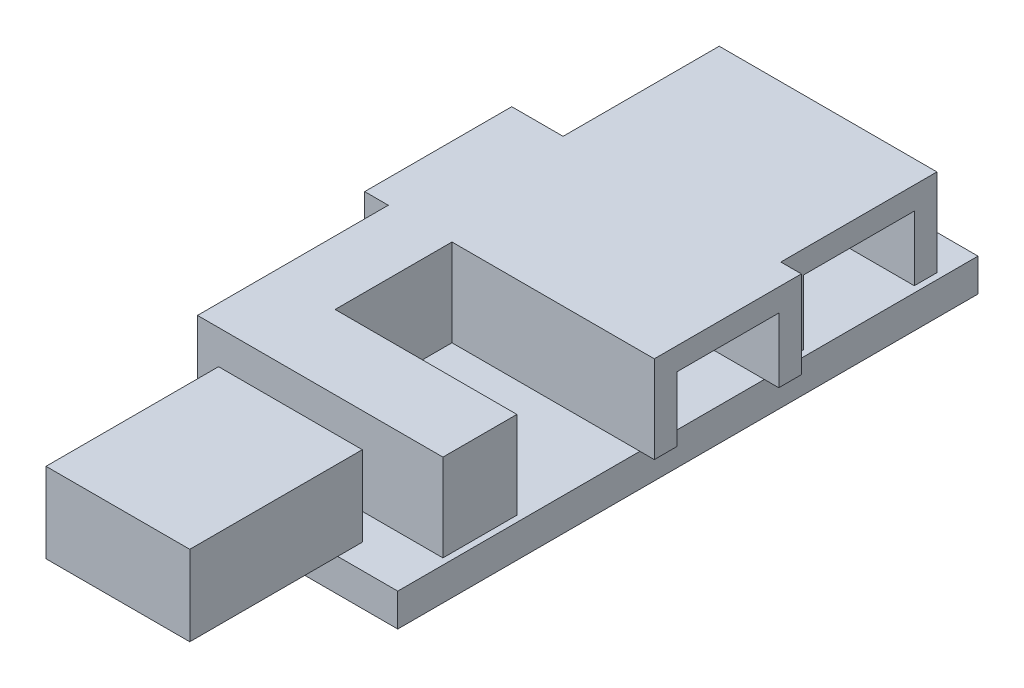
ISO-10303-21;
HEADER;
FILE_DESCRIPTION(('STEP AP214'),'2;1');
FILE_NAME('part.step','',(''),(''),'','','');
FILE_SCHEMA(('AUTOMOTIVE_DESIGN { 1 0 10303 214 1 1 1 1 }'));
ENDSEC;
DATA;
#1=APPLICATION_CONTEXT('core data for automotive mechanical design processes');
#2=APPLICATION_PROTOCOL_DEFINITION('international standard','automotive_design',2000,#1);
#3=PRODUCT_CONTEXT('',#1,'mechanical');
#4=PRODUCT('Part','Part','',(#3));
#5=PRODUCT_RELATED_PRODUCT_CATEGORY('part','',(#4));
#6=PRODUCT_DEFINITION_FORMATION('','',#4);
#7=PRODUCT_DEFINITION_CONTEXT('part definition',#1,'design');
#8=PRODUCT_DEFINITION('design','',#6,#7);
#9=PRODUCT_DEFINITION_SHAPE('','',#8);
#10=(LENGTH_UNIT() NAMED_UNIT(*) SI_UNIT(.MILLI.,.METRE.));
#11=(NAMED_UNIT(*) PLANE_ANGLE_UNIT() SI_UNIT($,.RADIAN.));
#12=(NAMED_UNIT(*) SI_UNIT($,.STERADIAN.) SOLID_ANGLE_UNIT());
#13=UNCERTAINTY_MEASURE_WITH_UNIT(LENGTH_MEASURE(1.E-05),#10,'distance_accuracy_value','');
#14=(GEOMETRIC_REPRESENTATION_CONTEXT(3) GLOBAL_UNCERTAINTY_ASSIGNED_CONTEXT((#13)) GLOBAL_UNIT_ASSIGNED_CONTEXT((#10,
#11,#12)) REPRESENTATION_CONTEXT('',''));
#15=CARTESIAN_POINT('',(0.,0.,0.));
#16=DIRECTION('',(0.,0.,1.));
#17=DIRECTION('',(1.,0.,0.));
#18=AXIS2_PLACEMENT_3D('',#15,#16,#17);
#19=CARTESIAN_POINT('',(-62.6318930317582,4.064,0.824393123125533));
#20=DIRECTION('',(0.,1.,0.));
#21=DIRECTION('',(0.,0.,1.));
#22=AXIS2_PLACEMENT_3D('',#19,#20,#21);
#23=PLANE('',#22);
#24=DIRECTION('',(0.,0.,1.));
#25=VECTOR('',#24,1.);
#26=CARTESIAN_POINT('',(-16.3195,4.064,-35.8775));
#27=LINE('',#26,#25);
#28=CARTESIAN_POINT('',(-16.3195,4.064,-12.2555));
#29=VERTEX_POINT('',#28);
#30=CARTESIAN_POINT('',(-16.3195,4.064,-9.46150000000001));
#31=VERTEX_POINT('',#30);
#32=EDGE_CURVE('E295',#29,#31,#27,.T.);
#33=ORIENTED_EDGE('',*,*,#32,.T.);
#34=DIRECTION('',(1.,0.,0.));
#35=VECTOR('',#34,1.);
#36=CARTESIAN_POINT('',(-17.716525,4.064,-9.46150000000001));
#37=LINE('',#36,#35);
#38=CARTESIAN_POINT('',(-17.7165,4.064,-9.46150000000001));
#39=VERTEX_POINT('',#38);
#40=EDGE_CURVE('E598',#39,#31,#37,.T.);
#41=ORIENTED_EDGE('',*,*,#40,.F.);
#42=DIRECTION('',(0.,0.,1.));
#43=VECTOR('',#42,1.);
#44=CARTESIAN_POINT('',(-17.7165,4.064,-12.2555));
#45=LINE('',#44,#43);
#46=CARTESIAN_POINT('',(-17.7165,4.064,-12.2555));
#47=VERTEX_POINT('',#46);
#48=EDGE_CURVE('E366',#47,#39,#45,.T.);
#49=ORIENTED_EDGE('',*,*,#48,.F.);
#50=DIRECTION('',(-1.,0.,0.));
#51=VECTOR('',#50,1.);
#52=CARTESIAN_POINT('',(18.0975,4.064,-12.2555));
#53=LINE('',#52,#51);
#54=EDGE_CURVE('E464',#29,#47,#53,.T.);
#55=ORIENTED_EDGE('',*,*,#54,.F.);
#56=EDGE_LOOP('',(#33,#41,#49,#55));
#57=FACE_BOUND('',#56,.T.);
#58=ADVANCED_FACE('F39',(#57),#23,.F.);
#59=DIRECTION('',(0.,0.,1.));
#60=VECTOR('',#59,1.);
#61=CARTESIAN_POINT('',(18.0975,4.064,-12.2555));
#62=LINE('',#61,#60);
#63=CARTESIAN_POINT('',(18.0975,4.064,-12.2555));
#64=VERTEX_POINT('',#63);
#65=CARTESIAN_POINT('',(18.0975,4.064,-9.46150000000001));
#66=VERTEX_POINT('',#65);
#67=EDGE_CURVE('E364',#64,#66,#62,.T.);
#68=ORIENTED_EDGE('',*,*,#67,.T.);
#69=CARTESIAN_POINT('',(16.3195,4.064,-9.46150000000001));
#70=VERTEX_POINT('',#69);
#71=EDGE_CURVE('E290',#70,#66,#37,.T.);
#72=ORIENTED_EDGE('',*,*,#71,.F.);
#73=DIRECTION('',(0.,0.,-1.));
#74=VECTOR('',#73,1.);
#75=CARTESIAN_POINT('',(16.3195,4.064,-35.8775));
#76=LINE('',#75,#74);
#77=CARTESIAN_POINT('',(16.3195,4.064,-12.2555));
#78=VERTEX_POINT('',#77);
#79=EDGE_CURVE('E318',#70,#78,#76,.T.);
#80=ORIENTED_EDGE('',*,*,#79,.T.);
#81=EDGE_CURVE('E453',#64,#78,#53,.T.);
#82=ORIENTED_EDGE('',*,*,#81,.F.);
#83=EDGE_LOOP('',(#68,#72,#80,#82));
#84=FACE_BOUND('',#83,.T.);
#85=ADVANCED_FACE('F611',(#84),#23,.F.);
#86=CARTESIAN_POINT('',(-16.3195,4.064,35.8775));
#87=DIRECTION('',(0.,-1.,0.));
#88=DIRECTION('',(0.,0.,-1.));
#89=AXIS2_PLACEMENT_3D('',#86,#87,#88);
#90=PLANE('',#89);
#91=DIRECTION('',(1.55455159639466E-13,0.,1.));
#92=VECTOR('',#91,1.);
#93=CARTESIAN_POINT('',(-8.89000000000332,4.064,32.8295));
#94=LINE('',#93,#92);
#95=CARTESIAN_POINT('',(-8.89000000000332,4.064,32.8295));
#96=VERTEX_POINT('',#95);
#97=CARTESIAN_POINT('',(-8.89000000000308,4.064,35.8775));
#98=VERTEX_POINT('',#97);
#99=EDGE_CURVE('E557',#96,#98,#94,.T.);
#100=ORIENTED_EDGE('',*,*,#99,.F.);
#101=DIRECTION('',(-1.,0.,0.));
#102=VECTOR('',#101,1.);
#103=CARTESIAN_POINT('',(-8.89000000000332,4.064,32.8295));
#104=LINE('',#103,#102);
#105=CARTESIAN_POINT('',(8.89,4.064,32.8295));
#106=VERTEX_POINT('',#105);
#107=EDGE_CURVE('E548',#106,#96,#104,.T.);
#108=ORIENTED_EDGE('',*,*,#107,.F.);
#109=DIRECTION('',(0.,0.,-1.));
#110=VECTOR('',#109,1.);
#111=CARTESIAN_POINT('',(8.89,4.064,35.8775));
#112=LINE('',#111,#110);
#113=CARTESIAN_POINT('',(8.89,4.064,35.8775));
#114=VERTEX_POINT('',#113);
#115=EDGE_CURVE('E386',#114,#106,#112,.T.);
#116=ORIENTED_EDGE('',*,*,#115,.F.);
#117=DIRECTION('',(1.,0.,0.));
#118=VECTOR('',#117,1.);
#119=CARTESIAN_POINT('',(16.3195,4.064,35.8775));
#120=LINE('',#119,#118);
#121=CARTESIAN_POINT('',(16.3195,4.064,35.8775));
#122=VERTEX_POINT('',#121);
#123=EDGE_CURVE('E301',#114,#122,#120,.T.);
#124=ORIENTED_EDGE('',*,*,#123,.T.);
#125=CARTESIAN_POINT('',(16.3195,4.064,5.93089999999999));
#126=VERTEX_POINT('',#125);
#127=EDGE_CURVE('E323',#122,#126,#76,.T.);
#128=ORIENTED_EDGE('',*,*,#127,.T.);
#129=DIRECTION('',(-1.,0.,0.));
#130=VECTOR('',#129,1.);
#131=CARTESIAN_POINT('',(18.0975,4.064,5.93089999999999));
#132=LINE('',#131,#130);
#133=CARTESIAN_POINT('',(-6.92150000000001,4.064,5.93089999999999));
#134=VERTEX_POINT('',#133);
#135=EDGE_CURVE('E355',#126,#134,#132,.T.);
#136=ORIENTED_EDGE('',*,*,#135,.T.);
#137=DIRECTION('',(0.,0.,1.));
#138=VECTOR('',#137,1.);
#139=CARTESIAN_POINT('',(-6.92150000000001,4.064,0.824393123125527));
#140=LINE('',#139,#138);
#141=CARTESIAN_POINT('',(-6.92150000000001,4.064,20.3835));
#142=VERTEX_POINT('',#141);
#143=EDGE_CURVE('E481',#134,#142,#140,.T.);
#144=ORIENTED_EDGE('',*,*,#143,.T.);
#145=DIRECTION('',(1.,0.,0.));
#146=VECTOR('',#145,1.);
#147=CARTESIAN_POINT('',(-62.6318930317582,4.064,20.3835));
#148=LINE('',#147,#146);
#149=CARTESIAN_POINT('',(15.5575,4.064,20.3835));
#150=VERTEX_POINT('',#149);
#151=EDGE_CURVE('E509',#142,#150,#148,.T.);
#152=ORIENTED_EDGE('',*,*,#151,.T.);
#153=DIRECTION('',(0.,0.,1.));
#154=VECTOR('',#153,1.);
#155=CARTESIAN_POINT('',(15.5575,4.064,0.824393123125563));
#156=LINE('',#155,#154);
#157=CARTESIAN_POINT('',(15.5575,4.064,29.5275));
#158=VERTEX_POINT('',#157);
#159=EDGE_CURVE('E512',#150,#158,#156,.T.);
#160=ORIENTED_EDGE('',*,*,#159,.T.);
#161=DIRECTION('',(1.,0.,0.));
#162=VECTOR('',#161,1.);
#163=CARTESIAN_POINT('',(-62.6318930317582,4.064,29.5275));
#164=LINE('',#163,#162);
#165=CARTESIAN_POINT('',(-14.7955,4.064,29.5275));
#166=VERTEX_POINT('',#165);
#167=EDGE_CURVE('E480',#166,#158,#164,.T.);
#168=ORIENTED_EDGE('',*,*,#167,.F.);
#169=DIRECTION('',(0.,0.,1.));
#170=VECTOR('',#169,1.);
#171=CARTESIAN_POINT('',(-14.7955,4.064,0.824393123125526));
#172=LINE('',#171,#170);
#173=CARTESIAN_POINT('',(-14.7955,4.064,5.9309));
#174=VERTEX_POINT('',#173);
#175=EDGE_CURVE('E478',#174,#166,#172,.T.);
#176=ORIENTED_EDGE('',*,*,#175,.F.);
#177=CARTESIAN_POINT('',(-16.3195,4.064,5.9309));
#178=VERTEX_POINT('',#177);
#179=EDGE_CURVE('E370',#174,#178,#132,.T.);
#180=ORIENTED_EDGE('',*,*,#179,.T.);
#181=CARTESIAN_POINT('',(-16.3195,4.064,35.8775));
#182=VERTEX_POINT('',#181);
#183=EDGE_CURVE('E294',#178,#182,#27,.T.);
#184=ORIENTED_EDGE('',*,*,#183,.T.);
#185=EDGE_CURVE('E307',#182,#98,#120,.T.);
#186=ORIENTED_EDGE('',*,*,#185,.T.);
#187=EDGE_LOOP('',(#100,#108,#116,#124,#128,#136,#144,#152,#160,#168,#176,#180,#184,#186));
#188=FACE_BOUND('',#187,.T.);
#189=ADVANCED_FACE('F687',(#188),#90,.F.);
#190=DIRECTION('',(1.,0.,0.));
#191=VECTOR('',#190,1.);
#192=CARTESIAN_POINT('',(-17.716525,4.064,-28.7655));
#193=LINE('',#192,#191);
#194=CARTESIAN_POINT('',(-11.3665,4.064,-28.7655));
#195=VERTEX_POINT('',#194);
#196=CARTESIAN_POINT('',(15.5575,4.064,-28.7655));
#197=VERTEX_POINT('',#196);
#198=EDGE_CURVE('E584',#195,#197,#193,.T.);
#199=ORIENTED_EDGE('',*,*,#198,.F.);
#200=DIRECTION('',(0.,0.,1.));
#201=VECTOR('',#200,1.);
#202=CARTESIAN_POINT('',(-11.3665,4.064,0.824393123125533));
#203=LINE('',#202,#201);
#204=CARTESIAN_POINT('',(-11.3665,4.064,-31.5595));
#205=VERTEX_POINT('',#204);
#206=EDGE_CURVE('E398',#205,#195,#203,.T.);
#207=ORIENTED_EDGE('',*,*,#206,.F.);
#208=DIRECTION('',(1.,0.,0.));
#209=VECTOR('',#208,1.);
#210=CARTESIAN_POINT('',(-62.6318930317582,4.064,-31.5595));
#211=LINE('',#210,#209);
#212=CARTESIAN_POINT('',(15.5575,4.064,-31.5595));
#213=VERTEX_POINT('',#212);
#214=EDGE_CURVE('E399',#205,#213,#211,.T.);
#215=ORIENTED_EDGE('',*,*,#214,.T.);
#216=DIRECTION('',(0.,0.,1.));
#217=VECTOR('',#216,1.);
#218=CARTESIAN_POINT('',(15.5575,4.064,0.824393123125533));
#219=LINE('',#218,#217);
#220=EDGE_CURVE('E379',#213,#197,#219,.T.);
#221=ORIENTED_EDGE('',*,*,#220,.T.);
#222=EDGE_LOOP('',(#199,#207,#215,#221));
#223=FACE_BOUND('',#222,.T.);
#224=CARTESIAN_POINT('',(-11.3665,4.064,-15.0495));
#225=VERTEX_POINT('',#224);
#226=CARTESIAN_POINT('',(-11.3665,4.064,-12.2555));
#227=VERTEX_POINT('',#226);
#228=EDGE_CURVE('E395',#225,#227,#203,.T.);
#229=ORIENTED_EDGE('',*,*,#228,.F.);
#230=DIRECTION('',(1.,0.,0.));
#231=VECTOR('',#230,1.);
#232=CARTESIAN_POINT('',(-17.716525,4.064,-15.0495));
#233=LINE('',#232,#231);
#234=CARTESIAN_POINT('',(15.5575,4.064,-15.0495));
#235=VERTEX_POINT('',#234);
#236=EDGE_CURVE('E580',#225,#235,#233,.T.);
#237=ORIENTED_EDGE('',*,*,#236,.T.);
#238=CARTESIAN_POINT('',(15.5575,4.064,-12.2555));
#239=VERTEX_POINT('',#238);
#240=EDGE_CURVE('E383',#235,#239,#219,.T.);
#241=ORIENTED_EDGE('',*,*,#240,.T.);
#242=EDGE_CURVE('E358',#78,#239,#53,.T.);
#243=ORIENTED_EDGE('',*,*,#242,.F.);
#244=CARTESIAN_POINT('',(16.3195,4.064,-35.8775));
#245=VERTEX_POINT('',#244);
#246=EDGE_CURVE('E315',#78,#245,#76,.T.);
#247=ORIENTED_EDGE('',*,*,#246,.T.);
#248=DIRECTION('',(-1.,0.,0.));
#249=VECTOR('',#248,1.);
#250=CARTESIAN_POINT('',(16.3195,4.064,-35.8775));
#251=LINE('',#250,#249);
#252=CARTESIAN_POINT('',(-16.3195,4.064,-35.8775));
#253=VERTEX_POINT('',#252);
#254=EDGE_CURVE('E329',#245,#253,#251,.T.);
#255=ORIENTED_EDGE('',*,*,#254,.T.);
#256=EDGE_CURVE('E297',#253,#29,#27,.T.);
#257=ORIENTED_EDGE('',*,*,#256,.T.);
#258=EDGE_CURVE('E458',#227,#29,#53,.T.);
#259=ORIENTED_EDGE('',*,*,#258,.F.);
#260=EDGE_LOOP('',(#229,#237,#241,#243,#247,#255,#257,#259));
#261=FACE_BOUND('',#260,.T.);
#262=ADVANCED_FACE('F629',(#223,#261),#90,.F.);
#263=CARTESIAN_POINT('',(-16.3195,4.064,-35.8775));
#264=DIRECTION('',(1.,0.,0.));
#265=DIRECTION('',(0.,0.,-1.));
#266=AXIS2_PLACEMENT_3D('',#263,#264,#265);
#267=PLANE('',#266);
#268=DIRECTION('',(0.,0.,1.));
#269=VECTOR('',#268,1.);
#270=CARTESIAN_POINT('',(-16.3195,0.,-35.8775));
#271=LINE('',#270,#269);
#272=CARTESIAN_POINT('',(-16.3195,0.,-35.8775));
#273=VERTEX_POINT('',#272);
#274=CARTESIAN_POINT('',(-16.3195,0.,35.8775));
#275=VERTEX_POINT('',#274);
#276=EDGE_CURVE('E339',#273,#275,#271,.T.);
#277=ORIENTED_EDGE('',*,*,#276,.T.);
#278=DIRECTION('',(0.,-1.,0.));
#279=VECTOR('',#278,1.);
#280=CARTESIAN_POINT('',(-16.3195,4.064,35.8775));
#281=LINE('',#280,#279);
#282=EDGE_CURVE('E352',#182,#275,#281,.T.);
#283=ORIENTED_EDGE('',*,*,#282,.F.);
#284=ORIENTED_EDGE('',*,*,#183,.F.);
#285=CARTESIAN_POINT('',(-16.3195,4.064,3.13689999999999));
#286=VERTEX_POINT('',#285);
#287=EDGE_CURVE('E287',#286,#178,#27,.T.);
#288=ORIENTED_EDGE('',*,*,#287,.F.);
#289=DIRECTION('',(0.,0.,-1.));
#290=VECTOR('',#289,1.);
#291=CARTESIAN_POINT('',(-16.3195,4.064,-35.8775));
#292=LINE('',#291,#290);
#293=EDGE_CURVE('E265',#286,#31,#292,.T.);
#294=ORIENTED_EDGE('',*,*,#293,.T.);
#295=ORIENTED_EDGE('',*,*,#32,.F.);
#296=ORIENTED_EDGE('',*,*,#256,.F.);
#297=DIRECTION('',(0.,-1.,0.));
#298=VECTOR('',#297,1.);
#299=CARTESIAN_POINT('',(-16.3195,4.064,-35.8775));
#300=LINE('',#299,#298);
#301=EDGE_CURVE('E332',#253,#273,#300,.T.);
#302=ORIENTED_EDGE('',*,*,#301,.T.);
#303=EDGE_LOOP('',(#277,#283,#284,#288,#294,#295,#296,#302));
#304=FACE_BOUND('',#303,.T.);
#305=ADVANCED_FACE('F41',(#304),#267,.F.);
#306=CARTESIAN_POINT('',(16.3195,4.064,35.8775));
#307=DIRECTION('',(0.,0.,-1.));
#308=DIRECTION('',(-1.,0.,0.));
#309=AXIS2_PLACEMENT_3D('',#306,#307,#308);
#310=PLANE('',#309);
#311=DIRECTION('',(1.,0.,0.));
#312=VECTOR('',#311,1.);
#313=CARTESIAN_POINT('',(16.3195,0.,35.8775));
#314=LINE('',#313,#312);
#315=CARTESIAN_POINT('',(16.3195,0.,35.8775));
#316=VERTEX_POINT('',#315);
#317=EDGE_CURVE('E341',#275,#316,#314,.T.);
#318=ORIENTED_EDGE('',*,*,#317,.T.);
#319=DIRECTION('',(0.,-1.,0.));
#320=VECTOR('',#319,1.);
#321=CARTESIAN_POINT('',(16.3195,4.064,35.8775));
#322=LINE('',#321,#320);
#323=EDGE_CURVE('E349',#122,#316,#322,.T.);
#324=ORIENTED_EDGE('',*,*,#323,.F.);
#325=ORIENTED_EDGE('',*,*,#123,.F.);
#326=EDGE_CURVE('E306',#98,#114,#120,.T.);
#327=ORIENTED_EDGE('',*,*,#326,.F.);
#328=ORIENTED_EDGE('',*,*,#185,.F.);
#329=ORIENTED_EDGE('',*,*,#282,.T.);
#330=EDGE_LOOP('',(#318,#324,#325,#327,#328,#329));
#331=FACE_BOUND('',#330,.T.);
#332=ADVANCED_FACE('F670',(#331),#310,.F.);
#333=CARTESIAN_POINT('',(16.3195,4.064,-35.8775));
#334=DIRECTION('',(-1.,0.,0.));
#335=DIRECTION('',(0.,0.,1.));
#336=AXIS2_PLACEMENT_3D('',#333,#334,#335);
#337=PLANE('',#336);
#338=DIRECTION('',(0.,0.,-1.));
#339=VECTOR('',#338,1.);
#340=CARTESIAN_POINT('',(16.3195,0.,-35.8775));
#341=LINE('',#340,#339);
#342=CARTESIAN_POINT('',(16.3195,0.,-35.8775));
#343=VERTEX_POINT('',#342);
#344=EDGE_CURVE('E344',#316,#343,#341,.T.);
#345=ORIENTED_EDGE('',*,*,#344,.T.);
#346=DIRECTION('',(0.,-1.,0.));
#347=VECTOR('',#346,1.);
#348=CARTESIAN_POINT('',(16.3195,4.064,-35.8775));
#349=LINE('',#348,#347);
#350=EDGE_CURVE('E336',#245,#343,#349,.T.);
#351=ORIENTED_EDGE('',*,*,#350,.F.);
#352=ORIENTED_EDGE('',*,*,#246,.F.);
#353=ORIENTED_EDGE('',*,*,#79,.F.);
#354=DIRECTION('',(0.,0.,1.));
#355=VECTOR('',#354,1.);
#356=CARTESIAN_POINT('',(16.3195,4.064,-35.8775));
#357=LINE('',#356,#355);
#358=CARTESIAN_POINT('',(16.3195,4.064,3.13689999999999));
#359=VERTEX_POINT('',#358);
#360=EDGE_CURVE('E277',#70,#359,#357,.T.);
#361=ORIENTED_EDGE('',*,*,#360,.T.);
#362=EDGE_CURVE('E319',#126,#359,#76,.T.);
#363=ORIENTED_EDGE('',*,*,#362,.F.);
#364=ORIENTED_EDGE('',*,*,#127,.F.);
#365=ORIENTED_EDGE('',*,*,#323,.T.);
#366=EDGE_LOOP('',(#345,#351,#352,#353,#361,#363,#364,#365));
#367=FACE_BOUND('',#366,.T.);
#368=ADVANCED_FACE('F614',(#367),#337,.F.);
#369=CARTESIAN_POINT('',(16.3195,4.064,-35.8775));
#370=DIRECTION('',(0.,0.,1.));
#371=DIRECTION('',(1.,0.,0.));
#372=AXIS2_PLACEMENT_3D('',#369,#370,#371);
#373=PLANE('',#372);
#374=DIRECTION('',(-1.,0.,0.));
#375=VECTOR('',#374,1.);
#376=CARTESIAN_POINT('',(16.3195,0.,-35.8775));
#377=LINE('',#376,#375);
#378=EDGE_CURVE('E298',#343,#273,#377,.T.);
#379=ORIENTED_EDGE('',*,*,#378,.T.);
#380=ORIENTED_EDGE('',*,*,#301,.F.);
#381=ORIENTED_EDGE('',*,*,#254,.F.);
#382=ORIENTED_EDGE('',*,*,#350,.T.);
#383=EDGE_LOOP('',(#379,#380,#381,#382));
#384=FACE_BOUND('',#383,.T.);
#385=ADVANCED_FACE('F618',(#384),#373,.F.);
#386=CARTESIAN_POINT('',(-16.3195,0.,35.8775));
#387=DIRECTION('',(0.,-1.,0.));
#388=DIRECTION('',(0.,0.,-1.));
#389=AXIS2_PLACEMENT_3D('',#386,#387,#388);
#390=PLANE('',#389);
#391=ORIENTED_EDGE('',*,*,#276,.F.);
#392=ORIENTED_EDGE('',*,*,#378,.F.);
#393=ORIENTED_EDGE('',*,*,#344,.F.);
#394=ORIENTED_EDGE('',*,*,#317,.F.);
#395=EDGE_LOOP('',(#391,#392,#393,#394));
#396=FACE_BOUND('',#395,.T.);
#397=ADVANCED_FACE('F672',(#396),#390,.T.);
#398=CARTESIAN_POINT('',(-17.7165,4.064,3.13689999999999));
#399=VERTEX_POINT('',#398);
#400=CARTESIAN_POINT('',(-17.7165,4.064,5.9309));
#401=VERTEX_POINT('',#400);
#402=EDGE_CURVE('E289',#399,#401,#45,.T.);
#403=ORIENTED_EDGE('',*,*,#402,.F.);
#404=DIRECTION('',(1.,0.,0.));
#405=VECTOR('',#404,1.);
#406=CARTESIAN_POINT('',(-17.716525,4.064,3.13689999999999));
#407=LINE('',#406,#405);
#408=EDGE_CURVE('E54',#399,#286,#407,.T.);
#409=ORIENTED_EDGE('',*,*,#408,.T.);
#410=ORIENTED_EDGE('',*,*,#287,.T.);
#411=EDGE_CURVE('E474',#178,#401,#132,.T.);
#412=ORIENTED_EDGE('',*,*,#411,.T.);
#413=EDGE_LOOP('',(#403,#409,#410,#412));
#414=FACE_BOUND('',#413,.T.);
#415=ADVANCED_FACE('F285',(#414),#23,.F.);
#416=ORIENTED_EDGE('',*,*,#362,.T.);
#417=CARTESIAN_POINT('',(18.0975,4.064,3.13689999999999));
#418=VERTEX_POINT('',#417);
#419=EDGE_CURVE('E281',#359,#418,#407,.T.);
#420=ORIENTED_EDGE('',*,*,#419,.T.);
#421=CARTESIAN_POINT('',(18.0975,4.064,5.93089999999999));
#422=VERTEX_POINT('',#421);
#423=EDGE_CURVE('E537',#418,#422,#62,.T.);
#424=ORIENTED_EDGE('',*,*,#423,.T.);
#425=EDGE_CURVE('E375',#422,#126,#132,.T.);
#426=ORIENTED_EDGE('',*,*,#425,.T.);
#427=EDGE_LOOP('',(#416,#420,#424,#426));
#428=FACE_BOUND('',#427,.T.);
#429=ADVANCED_FACE('F679',(#428),#23,.F.);
#430=CARTESIAN_POINT('',(15.5575,14.859,0.824393123125563));
#431=DIRECTION('',(1.,0.,0.));
#432=DIRECTION('',(0.,0.,-1.));
#433=AXIS2_PLACEMENT_3D('',#430,#431,#432);
#434=PLANE('',#433);
#435=ORIENTED_EDGE('',*,*,#159,.F.);
#436=DIRECTION('',(0.,-1.,0.));
#437=VECTOR('',#436,1.);
#438=CARTESIAN_POINT('',(15.5575,14.859,20.3835));
#439=LINE('',#438,#437);
#440=CARTESIAN_POINT('',(15.5575,14.859,20.3835));
#441=VERTEX_POINT('',#440);
#442=EDGE_CURVE('E342',#441,#150,#439,.T.);
#443=ORIENTED_EDGE('',*,*,#442,.F.);
#444=DIRECTION('',(0.,0.,1.));
#445=VECTOR('',#444,1.);
#446=CARTESIAN_POINT('',(15.5575,14.859,0.824393123125563));
#447=LINE('',#446,#445);
#448=CARTESIAN_POINT('',(15.5575,14.859,29.5275));
#449=VERTEX_POINT('',#448);
#450=EDGE_CURVE('E521',#441,#449,#447,.T.);
#451=ORIENTED_EDGE('',*,*,#450,.T.);
#452=DIRECTION('',(0.,-1.,0.));
#453=VECTOR('',#452,1.);
#454=CARTESIAN_POINT('',(15.5575,14.859,29.5275));
#455=LINE('',#454,#453);
#456=EDGE_CURVE('E522',#449,#158,#455,.T.);
#457=ORIENTED_EDGE('',*,*,#456,.T.);
#458=EDGE_LOOP('',(#435,#443,#451,#457));
#459=FACE_BOUND('',#458,.T.);
#460=ADVANCED_FACE('F707',(#459),#434,.T.);
#461=CARTESIAN_POINT('',(-62.6318930317582,14.859,20.3835));
#462=DIRECTION('',(0.,0.,-1.));
#463=DIRECTION('',(-1.,0.,0.));
#464=AXIS2_PLACEMENT_3D('',#461,#462,#463);
#465=PLANE('',#464);
#466=ORIENTED_EDGE('',*,*,#151,.F.);
#467=DIRECTION('',(0.,-1.,0.));
#468=VECTOR('',#467,1.);
#469=CARTESIAN_POINT('',(-6.92150000000001,14.859,20.3835));
#470=LINE('',#469,#468);
#471=CARTESIAN_POINT('',(-6.92150000000001,14.859,20.3835));
#472=VERTEX_POINT('',#471);
#473=EDGE_CURVE('E501',#472,#142,#470,.T.);
#474=ORIENTED_EDGE('',*,*,#473,.F.);
#475=DIRECTION('',(1.,0.,0.));
#476=VECTOR('',#475,1.);
#477=CARTESIAN_POINT('',(-62.6318930317582,14.859,20.3835));
#478=LINE('',#477,#476);
#479=EDGE_CURVE('E506',#472,#441,#478,.T.);
#480=ORIENTED_EDGE('',*,*,#479,.T.);
#481=ORIENTED_EDGE('',*,*,#442,.T.);
#482=EDGE_LOOP('',(#466,#474,#480,#481));
#483=FACE_BOUND('',#482,.T.);
#484=ADVANCED_FACE('F703',(#483),#465,.T.);
#485=CARTESIAN_POINT('',(-6.92150000000001,14.859,0.824393123125527));
#486=DIRECTION('',(1.,0.,0.));
#487=DIRECTION('',(0.,0.,-1.));
#488=AXIS2_PLACEMENT_3D('',#485,#486,#487);
#489=PLANE('',#488);
#490=ORIENTED_EDGE('',*,*,#143,.F.);
#491=DIRECTION('',(0.,-1.,0.));
#492=VECTOR('',#491,1.);
#493=CARTESIAN_POINT('',(-6.92150000000001,14.859,5.93089999999999));
#494=LINE('',#493,#492);
#495=CARTESIAN_POINT('',(-6.92150000000001,14.859,5.93089999999999));
#496=VERTEX_POINT('',#495);
#497=EDGE_CURVE('E491',#496,#134,#494,.T.);
#498=ORIENTED_EDGE('',*,*,#497,.F.);
#499=DIRECTION('',(0.,0.,1.));
#500=VECTOR('',#499,1.);
#501=CARTESIAN_POINT('',(-6.92150000000001,14.859,0.824393123125527));
#502=LINE('',#501,#500);
#503=EDGE_CURVE('E487',#496,#472,#502,.T.);
#504=ORIENTED_EDGE('',*,*,#503,.T.);
#505=ORIENTED_EDGE('',*,*,#473,.T.);
#506=EDGE_LOOP('',(#490,#498,#504,#505));
#507=FACE_BOUND('',#506,.T.);
#508=ADVANCED_FACE('F699',(#507),#489,.T.);
#509=CARTESIAN_POINT('',(-14.7955,14.859,0.824393123125526));
#510=DIRECTION('',(1.,0.,0.));
#511=DIRECTION('',(0.,0.,-1.));
#512=AXIS2_PLACEMENT_3D('',#509,#510,#511);
#513=PLANE('',#512);
#514=ORIENTED_EDGE('',*,*,#175,.T.);
#515=DIRECTION('',(0.,-1.,0.));
#516=VECTOR('',#515,1.);
#517=CARTESIAN_POINT('',(-14.7955,14.859,29.5275));
#518=LINE('',#517,#516);
#519=CARTESIAN_POINT('',(-14.7955,14.859,29.5275));
#520=VERTEX_POINT('',#519);
#521=EDGE_CURVE('E492',#520,#166,#518,.T.);
#522=ORIENTED_EDGE('',*,*,#521,.F.);
#523=DIRECTION('',(0.,0.,1.));
#524=VECTOR('',#523,1.);
#525=CARTESIAN_POINT('',(-14.7955,14.859,0.824393123125526));
#526=LINE('',#525,#524);
#527=CARTESIAN_POINT('',(-14.7955,14.859,5.9309));
#528=VERTEX_POINT('',#527);
#529=EDGE_CURVE('E484',#528,#520,#526,.T.);
#530=ORIENTED_EDGE('',*,*,#529,.F.);
#531=DIRECTION('',(0.,-1.,0.));
#532=VECTOR('',#531,1.);
#533=CARTESIAN_POINT('',(-14.7955,14.859,5.9309));
#534=LINE('',#533,#532);
#535=EDGE_CURVE('E488',#528,#174,#534,.T.);
#536=ORIENTED_EDGE('',*,*,#535,.T.);
#537=EDGE_LOOP('',(#514,#522,#530,#536));
#538=FACE_BOUND('',#537,.T.);
#539=ADVANCED_FACE('F695',(#538),#513,.F.);
#540=CARTESIAN_POINT('',(-62.6318930317582,14.859,29.5275));
#541=DIRECTION('',(0.,0.,-1.));
#542=DIRECTION('',(-1.,0.,0.));
#543=AXIS2_PLACEMENT_3D('',#540,#541,#542);
#544=PLANE('',#543);
#545=ORIENTED_EDGE('',*,*,#167,.T.);
#546=ORIENTED_EDGE('',*,*,#456,.F.);
#547=DIRECTION('',(1.,0.,0.));
#548=VECTOR('',#547,1.);
#549=CARTESIAN_POINT('',(-62.6318930317582,14.859,29.5275));
#550=LINE('',#549,#548);
#551=EDGE_CURVE('E486',#520,#449,#550,.T.);
#552=ORIENTED_EDGE('',*,*,#551,.F.);
#553=ORIENTED_EDGE('',*,*,#521,.T.);
#554=EDGE_LOOP('',(#545,#546,#552,#553));
#555=FACE_BOUND('',#554,.T.);
#556=ADVANCED_FACE('F692',(#555),#544,.F.);
#557=CARTESIAN_POINT('',(-62.6318930317582,14.859,0.824393123125533));
#558=DIRECTION('',(0.,1.,0.));
#559=DIRECTION('',(0.,0.,1.));
#560=AXIS2_PLACEMENT_3D('',#557,#558,#559);
#561=PLANE('',#560);
#562=ORIENTED_EDGE('',*,*,#450,.F.);
#563=ORIENTED_EDGE('',*,*,#479,.F.);
#564=ORIENTED_EDGE('',*,*,#503,.F.);
#565=DIRECTION('',(-1.,0.,0.));
#566=VECTOR('',#565,1.);
#567=CARTESIAN_POINT('',(18.0975,14.859,5.93089999999999));
#568=LINE('',#567,#566);
#569=CARTESIAN_POINT('',(18.0975,14.859,5.93089999999999));
#570=VERTEX_POINT('',#569);
#571=EDGE_CURVE('E437',#570,#496,#568,.T.);
#572=ORIENTED_EDGE('',*,*,#571,.F.);
#573=DIRECTION('',(0.,0.,1.));
#574=VECTOR('',#573,1.);
#575=CARTESIAN_POINT('',(18.0975,14.859,-12.2555));
#576=LINE('',#575,#574);
#577=CARTESIAN_POINT('',(18.0975,14.859,-12.2555));
#578=VERTEX_POINT('',#577);
#579=EDGE_CURVE('E440',#578,#570,#576,.T.);
#580=ORIENTED_EDGE('',*,*,#579,.F.);
#581=DIRECTION('',(-1.,0.,0.));
#582=VECTOR('',#581,1.);
#583=CARTESIAN_POINT('',(18.0975,14.859,-12.2555));
#584=LINE('',#583,#582);
#585=CARTESIAN_POINT('',(15.5575,14.859,-12.2555));
#586=VERTEX_POINT('',#585);
#587=EDGE_CURVE('E429',#578,#586,#584,.T.);
#588=ORIENTED_EDGE('',*,*,#587,.T.);
#589=DIRECTION('',(0.,0.,1.));
#590=VECTOR('',#589,1.);
#591=CARTESIAN_POINT('',(15.5575,14.859,0.824393123125533));
#592=LINE('',#591,#590);
#593=CARTESIAN_POINT('',(15.5575,14.859,-31.5595));
#594=VERTEX_POINT('',#593);
#595=EDGE_CURVE('E411',#594,#586,#592,.T.);
#596=ORIENTED_EDGE('',*,*,#595,.F.);
#597=DIRECTION('',(1.,0.,0.));
#598=VECTOR('',#597,1.);
#599=CARTESIAN_POINT('',(-62.6318930317582,14.859,-31.5595));
#600=LINE('',#599,#598);
#601=CARTESIAN_POINT('',(-11.3665,14.859,-31.5595));
#602=VERTEX_POINT('',#601);
#603=EDGE_CURVE('E426',#602,#594,#600,.T.);
#604=ORIENTED_EDGE('',*,*,#603,.F.);
#605=DIRECTION('',(0.,0.,1.));
#606=VECTOR('',#605,1.);
#607=CARTESIAN_POINT('',(-11.3665,14.859,0.824393123125533));
#608=LINE('',#607,#606);
#609=CARTESIAN_POINT('',(-11.3665,14.859,-12.2555));
#610=VERTEX_POINT('',#609);
#611=EDGE_CURVE('E410',#602,#610,#608,.T.);
#612=ORIENTED_EDGE('',*,*,#611,.T.);
#613=CARTESIAN_POINT('',(-17.7165,14.859,-12.2555));
#614=VERTEX_POINT('',#613);
#615=EDGE_CURVE('E427',#610,#614,#584,.T.);
#616=ORIENTED_EDGE('',*,*,#615,.T.);
#617=DIRECTION('',(0.,0.,1.));
#618=VECTOR('',#617,1.);
#619=CARTESIAN_POINT('',(-17.7165,14.859,-12.2555));
#620=LINE('',#619,#618);
#621=CARTESIAN_POINT('',(-17.7165,14.859,5.9309));
#622=VERTEX_POINT('',#621);
#623=EDGE_CURVE('E430',#614,#622,#620,.T.);
#624=ORIENTED_EDGE('',*,*,#623,.T.);
#625=EDGE_CURVE('E443',#528,#622,#568,.T.);
#626=ORIENTED_EDGE('',*,*,#625,.F.);
#627=ORIENTED_EDGE('',*,*,#529,.T.);
#628=ORIENTED_EDGE('',*,*,#551,.T.);
#629=EDGE_LOOP('',(#562,#563,#564,#572,#580,#588,#596,#604,#612,#616,#624,#626,#627,#628));
#630=FACE_BOUND('',#629,.T.);
#631=ADVANCED_FACE('F690',(#630),#561,.T.);
#632=CARTESIAN_POINT('',(-11.3665,14.859,0.824393123125533));
#633=DIRECTION('',(1.,0.,0.));
#634=DIRECTION('',(0.,0.,-1.));
#635=AXIS2_PLACEMENT_3D('',#632,#633,#634);
#636=PLANE('',#635);
#637=ORIENTED_EDGE('',*,*,#206,.T.);
#638=DIRECTION('',(0.,1.,0.));
#639=VECTOR('',#638,1.);
#640=CARTESIAN_POINT('',(-11.3665,14.859,-28.7655));
#641=LINE('',#640,#639);
#642=CARTESIAN_POINT('',(-11.3665,12.065,-28.7655));
#643=VERTEX_POINT('',#642);
#644=EDGE_CURVE('E571',#195,#643,#641,.T.);
#645=ORIENTED_EDGE('',*,*,#644,.T.);
#646=DIRECTION('',(0.,0.,1.));
#647=VECTOR('',#646,1.);
#648=CARTESIAN_POINT('',(-11.3665,12.065,0.824393123125533));
#649=LINE('',#648,#647);
#650=CARTESIAN_POINT('',(-11.3665,12.065,-15.0495));
#651=VERTEX_POINT('',#650);
#652=EDGE_CURVE('E568',#643,#651,#649,.T.);
#653=ORIENTED_EDGE('',*,*,#652,.T.);
#654=DIRECTION('',(0.,-1.,0.));
#655=VECTOR('',#654,1.);
#656=CARTESIAN_POINT('',(-11.3665,14.859,-15.0495));
#657=LINE('',#656,#655);
#658=EDGE_CURVE('E574',#651,#225,#657,.T.);
#659=ORIENTED_EDGE('',*,*,#658,.T.);
#660=ORIENTED_EDGE('',*,*,#228,.T.);
#661=DIRECTION('',(0.,-1.,0.));
#662=VECTOR('',#661,1.);
#663=CARTESIAN_POINT('',(-11.3665,14.859,-12.2555));
#664=LINE('',#663,#662);
#665=EDGE_CURVE('E409',#610,#227,#664,.T.);
#666=ORIENTED_EDGE('',*,*,#665,.F.);
#667=ORIENTED_EDGE('',*,*,#611,.F.);
#668=DIRECTION('',(0.,-1.,0.));
#669=VECTOR('',#668,1.);
#670=CARTESIAN_POINT('',(-11.3665,14.859,-31.5595));
#671=LINE('',#670,#669);
#672=EDGE_CURVE('E418',#602,#205,#671,.T.);
#673=ORIENTED_EDGE('',*,*,#672,.T.);
#674=EDGE_LOOP('',(#637,#645,#653,#659,#660,#666,#667,#673));
#675=FACE_BOUND('',#674,.T.);
#676=ADVANCED_FACE('F633',(#675),#636,.F.);
#677=CARTESIAN_POINT('',(-62.6318930317582,14.859,-31.5595));
#678=DIRECTION('',(0.,0.,-1.));
#679=DIRECTION('',(-1.,0.,0.));
#680=AXIS2_PLACEMENT_3D('',#677,#678,#679);
#681=PLANE('',#680);
#682=ORIENTED_EDGE('',*,*,#214,.F.);
#683=ORIENTED_EDGE('',*,*,#672,.F.);
#684=ORIENTED_EDGE('',*,*,#603,.T.);
#685=DIRECTION('',(0.,-1.,0.));
#686=VECTOR('',#685,1.);
#687=CARTESIAN_POINT('',(15.5575,14.859,-31.5595));
#688=LINE('',#687,#686);
#689=EDGE_CURVE('E516',#594,#213,#688,.T.);
#690=ORIENTED_EDGE('',*,*,#689,.T.);
#691=EDGE_LOOP('',(#682,#683,#684,#690));
#692=FACE_BOUND('',#691,.T.);
#693=ADVANCED_FACE('F713',(#692),#681,.T.);
#694=CARTESIAN_POINT('',(15.5575,14.859,0.824393123125533));
#695=DIRECTION('',(1.,0.,0.));
#696=DIRECTION('',(0.,0.,-1.));
#697=AXIS2_PLACEMENT_3D('',#694,#695,#696);
#698=PLANE('',#697);
#699=DIRECTION('',(0.,1.,0.));
#700=VECTOR('',#699,1.);
#701=CARTESIAN_POINT('',(15.5575,14.859,-28.7655));
#702=LINE('',#701,#700);
#703=CARTESIAN_POINT('',(15.5575,12.065,-28.7655));
#704=VERTEX_POINT('',#703);
#705=EDGE_CURVE('E392',#197,#704,#702,.T.);
#706=ORIENTED_EDGE('',*,*,#705,.F.);
#707=ORIENTED_EDGE('',*,*,#220,.F.);
#708=ORIENTED_EDGE('',*,*,#689,.F.);
#709=ORIENTED_EDGE('',*,*,#595,.T.);
#710=DIRECTION('',(0.,-1.,0.));
#711=VECTOR('',#710,1.);
#712=CARTESIAN_POINT('',(15.5575,14.859,-12.2555));
#713=LINE('',#712,#711);
#714=EDGE_CURVE('E404',#586,#239,#713,.T.);
#715=ORIENTED_EDGE('',*,*,#714,.T.);
#716=ORIENTED_EDGE('',*,*,#240,.F.);
#717=DIRECTION('',(0.,-1.,0.));
#718=VECTOR('',#717,1.);
#719=CARTESIAN_POINT('',(15.5575,14.859,-15.0495));
#720=LINE('',#719,#718);
#721=CARTESIAN_POINT('',(15.5575,12.065,-15.0495));
#722=VERTEX_POINT('',#721);
#723=EDGE_CURVE('E387',#722,#235,#720,.T.);
#724=ORIENTED_EDGE('',*,*,#723,.F.);
#725=DIRECTION('',(0.,0.,1.));
#726=VECTOR('',#725,1.);
#727=CARTESIAN_POINT('',(15.5575,12.065,0.824393123125533));
#728=LINE('',#727,#726);
#729=EDGE_CURVE('E389',#704,#722,#728,.T.);
#730=ORIENTED_EDGE('',*,*,#729,.F.);
#731=EDGE_LOOP('',(#706,#707,#708,#709,#715,#716,#724,#730));
#732=FACE_BOUND('',#731,.T.);
#733=ADVANCED_FACE('F645',(#732),#698,.T.);
#734=CARTESIAN_POINT('',(18.0975,14.859,-12.2555));
#735=DIRECTION('',(0.,0.,1.));
#736=DIRECTION('',(1.,0.,0.));
#737=AXIS2_PLACEMENT_3D('',#734,#735,#736);
#738=PLANE('',#737);
#739=ORIENTED_EDGE('',*,*,#615,.F.);
#740=ORIENTED_EDGE('',*,*,#665,.T.);
#741=ORIENTED_EDGE('',*,*,#258,.T.);
#742=ORIENTED_EDGE('',*,*,#54,.T.);
#743=DIRECTION('',(0.,-1.,0.));
#744=VECTOR('',#743,1.);
#745=CARTESIAN_POINT('',(-17.7165,14.859,-12.2555));
#746=LINE('',#745,#744);
#747=EDGE_CURVE('E1065',#614,#47,#746,.T.);
#748=ORIENTED_EDGE('',*,*,#747,.F.);
#749=EDGE_LOOP('',(#739,#740,#741,#742,#748));
#750=FACE_BOUND('',#749,.T.);
#751=ADVANCED_FACE('F627',(#750),#738,.F.);
#752=ORIENTED_EDGE('',*,*,#714,.F.);
#753=ORIENTED_EDGE('',*,*,#587,.F.);
#754=DIRECTION('',(0.,-1.,0.));
#755=VECTOR('',#754,1.);
#756=CARTESIAN_POINT('',(18.0975,14.859,-12.2555));
#757=LINE('',#756,#755);
#758=EDGE_CURVE('E385',#578,#64,#757,.T.);
#759=ORIENTED_EDGE('',*,*,#758,.T.);
#760=ORIENTED_EDGE('',*,*,#81,.T.);
#761=ORIENTED_EDGE('',*,*,#242,.T.);
#762=EDGE_LOOP('',(#752,#753,#759,#760,#761));
#763=FACE_BOUND('',#762,.T.);
#764=ADVANCED_FACE('F647',(#763),#738,.F.);
#765=CARTESIAN_POINT('',(-17.7165,14.859,-12.2555));
#766=DIRECTION('',(1.,0.,0.));
#767=DIRECTION('',(0.,0.,-1.));
#768=AXIS2_PLACEMENT_3D('',#765,#766,#767);
#769=PLANE('',#768);
#770=ORIENTED_EDGE('',*,*,#48,.T.);
#771=DIRECTION('',(0.,1.,0.));
#772=VECTOR('',#771,1.);
#773=CARTESIAN_POINT('',(-17.7165,14.859,-9.46150000000001));
#774=LINE('',#773,#772);
#775=CARTESIAN_POINT('',(-17.7165,12.065,-9.46150000000001));
#776=VERTEX_POINT('',#775);
#777=EDGE_CURVE('E276',#39,#776,#774,.T.);
#778=ORIENTED_EDGE('',*,*,#777,.T.);
#779=DIRECTION('',(0.,0.,1.));
#780=VECTOR('',#779,1.);
#781=CARTESIAN_POINT('',(-17.7165,12.065,-12.2555));
#782=LINE('',#781,#780);
#783=CARTESIAN_POINT('',(-17.7165,12.065,3.13689999999999));
#784=VERTEX_POINT('',#783);
#785=EDGE_CURVE('E581',#776,#784,#782,.T.);
#786=ORIENTED_EDGE('',*,*,#785,.T.);
#787=DIRECTION('',(0.,-1.,0.));
#788=VECTOR('',#787,1.);
#789=CARTESIAN_POINT('',(-17.7165,14.859,3.13689999999999));
#790=LINE('',#789,#788);
#791=EDGE_CURVE('E593',#784,#399,#790,.T.);
#792=ORIENTED_EDGE('',*,*,#791,.T.);
#793=ORIENTED_EDGE('',*,*,#402,.T.);
#794=DIRECTION('',(0.,-1.,0.));
#795=VECTOR('',#794,1.);
#796=CARTESIAN_POINT('',(-17.7165,14.859,5.9309));
#797=LINE('',#796,#795);
#798=EDGE_CURVE('E1062',#622,#401,#797,.T.);
#799=ORIENTED_EDGE('',*,*,#798,.F.);
#800=ORIENTED_EDGE('',*,*,#623,.F.);
#801=ORIENTED_EDGE('',*,*,#747,.T.);
#802=EDGE_LOOP('',(#770,#778,#786,#792,#793,#799,#800,#801));
#803=FACE_BOUND('',#802,.T.);
#804=ADVANCED_FACE('F722',(#803),#769,.F.);
#805=CARTESIAN_POINT('',(18.0975,14.859,-12.2555));
#806=DIRECTION('',(1.,0.,0.));
#807=DIRECTION('',(0.,0.,-1.));
#808=AXIS2_PLACEMENT_3D('',#805,#806,#807);
#809=PLANE('',#808);
#810=DIRECTION('',(0.,1.,0.));
#811=VECTOR('',#810,1.);
#812=CARTESIAN_POINT('',(18.0975,14.859,-9.46150000000001));
#813=LINE('',#812,#811);
#814=CARTESIAN_POINT('',(18.0975,12.065,-9.46150000000001));
#815=VERTEX_POINT('',#814);
#816=EDGE_CURVE('E11',#66,#815,#813,.T.);
#817=ORIENTED_EDGE('',*,*,#816,.F.);
#818=ORIENTED_EDGE('',*,*,#67,.F.);
#819=ORIENTED_EDGE('',*,*,#758,.F.);
#820=ORIENTED_EDGE('',*,*,#579,.T.);
#821=DIRECTION('',(0.,-1.,0.));
#822=VECTOR('',#821,1.);
#823=CARTESIAN_POINT('',(18.0975,14.859,5.93089999999999));
#824=LINE('',#823,#822);
#825=EDGE_CURVE('E466',#570,#422,#824,.T.);
#826=ORIENTED_EDGE('',*,*,#825,.T.);
#827=ORIENTED_EDGE('',*,*,#423,.F.);
#828=DIRECTION('',(0.,-1.,0.));
#829=VECTOR('',#828,1.);
#830=CARTESIAN_POINT('',(18.0975,14.859,3.13689999999999));
#831=LINE('',#830,#829);
#832=CARTESIAN_POINT('',(18.0975,12.065,3.13689999999999));
#833=VERTEX_POINT('',#832);
#834=EDGE_CURVE('E394',#833,#418,#831,.T.);
#835=ORIENTED_EDGE('',*,*,#834,.F.);
#836=DIRECTION('',(0.,0.,1.));
#837=VECTOR('',#836,1.);
#838=CARTESIAN_POINT('',(18.0975,12.065,-12.2555));
#839=LINE('',#838,#837);
#840=EDGE_CURVE('E47',#815,#833,#839,.T.);
#841=ORIENTED_EDGE('',*,*,#840,.F.);
#842=EDGE_LOOP('',(#817,#818,#819,#820,#826,#827,#835,#841));
#843=FACE_BOUND('',#842,.T.);
#844=ADVANCED_FACE('F723',(#843),#809,.T.);
#845=CARTESIAN_POINT('',(18.0975,14.859,5.93089999999999));
#846=DIRECTION('',(0.,0.,1.));
#847=DIRECTION('',(1.,0.,0.));
#848=AXIS2_PLACEMENT_3D('',#845,#846,#847);
#849=PLANE('',#848);
#850=ORIENTED_EDGE('',*,*,#571,.T.);
#851=ORIENTED_EDGE('',*,*,#497,.T.);
#852=ORIENTED_EDGE('',*,*,#135,.F.);
#853=ORIENTED_EDGE('',*,*,#425,.F.);
#854=ORIENTED_EDGE('',*,*,#825,.F.);
#855=EDGE_LOOP('',(#850,#851,#852,#853,#854));
#856=FACE_BOUND('',#855,.T.);
#857=ADVANCED_FACE('F719',(#856),#849,.T.);
#858=ORIENTED_EDGE('',*,*,#535,.F.);
#859=ORIENTED_EDGE('',*,*,#625,.T.);
#860=ORIENTED_EDGE('',*,*,#798,.T.);
#861=ORIENTED_EDGE('',*,*,#411,.F.);
#862=ORIENTED_EDGE('',*,*,#179,.F.);
#863=EDGE_LOOP('',(#858,#859,#860,#861,#862));
#864=FACE_BOUND('',#863,.T.);
#865=ADVANCED_FACE('F729',(#864),#849,.T.);
#866=CARTESIAN_POINT('',(-8.89,4.064,54.1655));
#867=DIRECTION('',(0.,1.,0.));
#868=DIRECTION('',(0.,0.,1.));
#869=AXIS2_PLACEMENT_3D('',#866,#867,#868);
#870=PLANE('',#869);
#871=CARTESIAN_POINT('',(-8.89,4.064,54.1655));
#872=VERTEX_POINT('',#871);
#873=EDGE_CURVE('E560',#98,#872,#94,.T.);
#874=ORIENTED_EDGE('',*,*,#873,.F.);
#875=ORIENTED_EDGE('',*,*,#326,.T.);
#876=DIRECTION('',(0.,0.,-1.));
#877=VECTOR('',#876,1.);
#878=CARTESIAN_POINT('',(8.89,4.064,32.8295));
#879=LINE('',#878,#877);
#880=CARTESIAN_POINT('',(8.89,4.064,54.1655));
#881=VERTEX_POINT('',#880);
#882=EDGE_CURVE('E552',#881,#114,#879,.T.);
#883=ORIENTED_EDGE('',*,*,#882,.F.);
#884=DIRECTION('',(1.,0.,0.));
#885=VECTOR('',#884,1.);
#886=CARTESIAN_POINT('',(-8.89,4.064,54.1655));
#887=LINE('',#886,#885);
#888=EDGE_CURVE('E555',#872,#881,#887,.T.);
#889=ORIENTED_EDGE('',*,*,#888,.F.);
#890=EDGE_LOOP('',(#874,#875,#883,#889));
#891=FACE_BOUND('',#890,.T.);
#892=ADVANCED_FACE('F668',(#891),#870,.F.);
#893=CARTESIAN_POINT('',(-8.89000000000332,13.97,32.8295));
#894=DIRECTION('',(1.,0.,-1.55455159639466E-13));
#895=DIRECTION('',(-1.55455159639466E-13,0.,-1.));
#896=AXIS2_PLACEMENT_3D('',#893,#894,#895);
#897=PLANE('',#896);
#898=ORIENTED_EDGE('',*,*,#99,.T.);
#899=ORIENTED_EDGE('',*,*,#873,.T.);
#900=DIRECTION('',(0.,-1.,0.));
#901=VECTOR('',#900,1.);
#902=CARTESIAN_POINT('',(-8.89,13.97,54.1655));
#903=LINE('',#902,#901);
#904=CARTESIAN_POINT('',(-8.89,13.97,54.1655));
#905=VERTEX_POINT('',#904);
#906=EDGE_CURVE('E534',#905,#872,#903,.T.);
#907=ORIENTED_EDGE('',*,*,#906,.F.);
#908=DIRECTION('',(1.55455159639466E-13,0.,1.));
#909=VECTOR('',#908,1.);
#910=CARTESIAN_POINT('',(-8.89000000000332,13.97,32.8295));
#911=LINE('',#910,#909);
#912=CARTESIAN_POINT('',(-8.89000000000332,13.97,32.8295));
#913=VERTEX_POINT('',#912);
#914=EDGE_CURVE('E551',#913,#905,#911,.T.);
#915=ORIENTED_EDGE('',*,*,#914,.F.);
#916=DIRECTION('',(0.,-1.,0.));
#917=VECTOR('',#916,1.);
#918=CARTESIAN_POINT('',(-8.89000000000332,13.97,32.8295));
#919=LINE('',#918,#917);
#920=EDGE_CURVE('E544',#913,#96,#919,.T.);
#921=ORIENTED_EDGE('',*,*,#920,.T.);
#922=EDGE_LOOP('',(#898,#899,#907,#915,#921));
#923=FACE_BOUND('',#922,.T.);
#924=ADVANCED_FACE('F737',(#923),#897,.F.);
#925=CARTESIAN_POINT('',(-8.89,13.97,54.1655));
#926=DIRECTION('',(0.,0.,-1.));
#927=DIRECTION('',(-1.,0.,0.));
#928=AXIS2_PLACEMENT_3D('',#925,#926,#927);
#929=PLANE('',#928);
#930=ORIENTED_EDGE('',*,*,#888,.T.);
#931=DIRECTION('',(0.,-1.,0.));
#932=VECTOR('',#931,1.);
#933=CARTESIAN_POINT('',(8.89,13.97,54.1655));
#934=LINE('',#933,#932);
#935=CARTESIAN_POINT('',(8.89,13.97,54.1655));
#936=VERTEX_POINT('',#935);
#937=EDGE_CURVE('E538',#936,#881,#934,.T.);
#938=ORIENTED_EDGE('',*,*,#937,.F.);
#939=DIRECTION('',(1.,0.,0.));
#940=VECTOR('',#939,1.);
#941=CARTESIAN_POINT('',(-8.89,13.97,54.1655));
#942=LINE('',#941,#940);
#943=EDGE_CURVE('E564',#905,#936,#942,.T.);
#944=ORIENTED_EDGE('',*,*,#943,.F.);
#945=ORIENTED_EDGE('',*,*,#906,.T.);
#946=EDGE_LOOP('',(#930,#938,#944,#945));
#947=FACE_BOUND('',#946,.T.);
#948=ADVANCED_FACE('F738',(#947),#929,.F.);
#949=CARTESIAN_POINT('',(8.89,13.97,32.8295));
#950=DIRECTION('',(-1.,0.,0.));
#951=DIRECTION('',(0.,0.,1.));
#952=AXIS2_PLACEMENT_3D('',#949,#950,#951);
#953=PLANE('',#952);
#954=ORIENTED_EDGE('',*,*,#882,.T.);
#955=ORIENTED_EDGE('',*,*,#115,.T.);
#956=DIRECTION('',(0.,-1.,0.));
#957=VECTOR('',#956,1.);
#958=CARTESIAN_POINT('',(8.89,13.97,32.8295));
#959=LINE('',#958,#957);
#960=CARTESIAN_POINT('',(8.89,13.97,32.8295));
#961=VERTEX_POINT('',#960);
#962=EDGE_CURVE('E541',#961,#106,#959,.T.);
#963=ORIENTED_EDGE('',*,*,#962,.F.);
#964=DIRECTION('',(0.,0.,-1.));
#965=VECTOR('',#964,1.);
#966=CARTESIAN_POINT('',(8.89,13.97,32.8295));
#967=LINE('',#966,#965);
#968=EDGE_CURVE('E562',#936,#961,#967,.T.);
#969=ORIENTED_EDGE('',*,*,#968,.F.);
#970=ORIENTED_EDGE('',*,*,#937,.T.);
#971=EDGE_LOOP('',(#954,#955,#963,#969,#970));
#972=FACE_BOUND('',#971,.T.);
#973=ADVANCED_FACE('F653',(#972),#953,.F.);
#974=CARTESIAN_POINT('',(-8.89000000000332,13.97,32.8295));
#975=DIRECTION('',(0.,0.,1.));
#976=DIRECTION('',(1.,0.,0.));
#977=AXIS2_PLACEMENT_3D('',#974,#975,#976);
#978=PLANE('',#977);
#979=ORIENTED_EDGE('',*,*,#107,.T.);
#980=ORIENTED_EDGE('',*,*,#920,.F.);
#981=DIRECTION('',(-1.,0.,0.));
#982=VECTOR('',#981,1.);
#983=CARTESIAN_POINT('',(-8.89000000000332,13.97,32.8295));
#984=LINE('',#983,#982);
#985=EDGE_CURVE('E547',#961,#913,#984,.T.);
#986=ORIENTED_EDGE('',*,*,#985,.F.);
#987=ORIENTED_EDGE('',*,*,#962,.T.);
#988=EDGE_LOOP('',(#979,#980,#986,#987));
#989=FACE_BOUND('',#988,.T.);
#990=ADVANCED_FACE('F658',(#989),#978,.F.);
#991=CARTESIAN_POINT('',(-8.89,13.97,54.1655));
#992=DIRECTION('',(0.,1.,0.));
#993=DIRECTION('',(0.,0.,1.));
#994=AXIS2_PLACEMENT_3D('',#991,#992,#993);
#995=PLANE('',#994);
#996=ORIENTED_EDGE('',*,*,#914,.T.);
#997=ORIENTED_EDGE('',*,*,#943,.T.);
#998=ORIENTED_EDGE('',*,*,#968,.T.);
#999=ORIENTED_EDGE('',*,*,#985,.T.);
#1000=EDGE_LOOP('',(#996,#997,#998,#999));
#1001=FACE_BOUND('',#1000,.T.);
#1002=ADVANCED_FACE('F662',(#1001),#995,.T.);
#1003=CARTESIAN_POINT('',(-17.716525,12.065,-28.7655));
#1004=DIRECTION('',(0.,1.,0.));
#1005=DIRECTION('',(0.,0.,1.));
#1006=AXIS2_PLACEMENT_3D('',#1003,#1004,#1005);
#1007=PLANE('',#1006);
#1008=DIRECTION('',(1.,0.,0.));
#1009=VECTOR('',#1008,1.);
#1010=CARTESIAN_POINT('',(-17.716525,12.065,-28.7655));
#1011=LINE('',#1010,#1009);
#1012=EDGE_CURVE('E577',#643,#704,#1011,.T.);
#1013=ORIENTED_EDGE('',*,*,#1012,.T.);
#1014=ORIENTED_EDGE('',*,*,#729,.T.);
#1015=DIRECTION('',(1.,0.,0.));
#1016=VECTOR('',#1015,1.);
#1017=CARTESIAN_POINT('',(-17.716525,12.065,-15.0495));
#1018=LINE('',#1017,#1016);
#1019=EDGE_CURVE('E578',#651,#722,#1018,.T.);
#1020=ORIENTED_EDGE('',*,*,#1019,.F.);
#1021=ORIENTED_EDGE('',*,*,#652,.F.);
#1022=EDGE_LOOP('',(#1013,#1014,#1020,#1021));
#1023=FACE_BOUND('',#1022,.T.);
#1024=ADVANCED_FACE('F639',(#1023),#1007,.F.);
#1025=CARTESIAN_POINT('',(-17.716525,4.064,-28.7655));
#1026=DIRECTION('',(0.,0.,-1.));
#1027=DIRECTION('',(-1.,0.,0.));
#1028=AXIS2_PLACEMENT_3D('',#1025,#1026,#1027);
#1029=PLANE('',#1028);
#1030=ORIENTED_EDGE('',*,*,#198,.T.);
#1031=ORIENTED_EDGE('',*,*,#705,.T.);
#1032=ORIENTED_EDGE('',*,*,#1012,.F.);
#1033=ORIENTED_EDGE('',*,*,#644,.F.);
#1034=EDGE_LOOP('',(#1030,#1031,#1032,#1033));
#1035=FACE_BOUND('',#1034,.T.);
#1036=ADVANCED_FACE('F755',(#1035),#1029,.F.);
#1037=CARTESIAN_POINT('',(-17.716525,12.065,-15.0495));
#1038=DIRECTION('',(0.,0.,1.));
#1039=DIRECTION('',(0.,-1.,0.));
#1040=AXIS2_PLACEMENT_3D('',#1037,#1038,#1039);
#1041=PLANE('',#1040);
#1042=ORIENTED_EDGE('',*,*,#1019,.T.);
#1043=ORIENTED_EDGE('',*,*,#723,.T.);
#1044=ORIENTED_EDGE('',*,*,#236,.F.);
#1045=ORIENTED_EDGE('',*,*,#658,.F.);
#1046=EDGE_LOOP('',(#1042,#1043,#1044,#1045));
#1047=FACE_BOUND('',#1046,.T.);
#1048=ADVANCED_FACE('F637',(#1047),#1041,.F.);
#1049=CARTESIAN_POINT('',(-17.716525,12.065,-9.46150000000001));
#1050=DIRECTION('',(0.,1.,0.));
#1051=DIRECTION('',(0.,0.,1.));
#1052=AXIS2_PLACEMENT_3D('',#1049,#1050,#1051);
#1053=PLANE('',#1052);
#1054=DIRECTION('',(1.,0.,0.));
#1055=VECTOR('',#1054,1.);
#1056=CARTESIAN_POINT('',(-17.716525,12.065,-9.46150000000001));
#1057=LINE('',#1056,#1055);
#1058=EDGE_CURVE('E595',#776,#815,#1057,.T.);
#1059=ORIENTED_EDGE('',*,*,#1058,.T.);
#1060=ORIENTED_EDGE('',*,*,#840,.T.);
#1061=DIRECTION('',(1.,0.,0.));
#1062=VECTOR('',#1061,1.);
#1063=CARTESIAN_POINT('',(-17.716525,12.065,3.13689999999999));
#1064=LINE('',#1063,#1062);
#1065=EDGE_CURVE('E60',#784,#833,#1064,.T.);
#1066=ORIENTED_EDGE('',*,*,#1065,.F.);
#1067=ORIENTED_EDGE('',*,*,#785,.F.);
#1068=EDGE_LOOP('',(#1059,#1060,#1066,#1067));
#1069=FACE_BOUND('',#1068,.T.);
#1070=ADVANCED_FACE('F758',(#1069),#1053,.F.);
#1071=CARTESIAN_POINT('',(-17.716525,4.064,-9.46150000000001));
#1072=DIRECTION('',(0.,0.,-1.));
#1073=DIRECTION('',(-1.,0.,0.));
#1074=AXIS2_PLACEMENT_3D('',#1071,#1072,#1073);
#1075=PLANE('',#1074);
#1076=ORIENTED_EDGE('',*,*,#40,.T.);
#1077=EDGE_CURVE('E270',#31,#70,#37,.T.);
#1078=ORIENTED_EDGE('',*,*,#1077,.T.);
#1079=ORIENTED_EDGE('',*,*,#71,.T.);
#1080=ORIENTED_EDGE('',*,*,#816,.T.);
#1081=ORIENTED_EDGE('',*,*,#1058,.F.);
#1082=ORIENTED_EDGE('',*,*,#777,.F.);
#1083=EDGE_LOOP('',(#1076,#1078,#1079,#1080,#1081,#1082));
#1084=FACE_BOUND('',#1083,.T.);
#1085=ADVANCED_FACE('F606',(#1084),#1075,.F.);
#1086=CARTESIAN_POINT('',(-17.716525,4.064,-9.46150000000001));
#1087=DIRECTION('',(0.,-1.,0.));
#1088=DIRECTION('',(0.,0.,-1.));
#1089=AXIS2_PLACEMENT_3D('',#1086,#1087,#1088);
#1090=PLANE('',#1089);
#1091=EDGE_CURVE('E267',#286,#359,#407,.T.);
#1092=ORIENTED_EDGE('',*,*,#1091,.T.);
#1093=ORIENTED_EDGE('',*,*,#360,.F.);
#1094=ORIENTED_EDGE('',*,*,#1077,.F.);
#1095=ORIENTED_EDGE('',*,*,#293,.F.);
#1096=EDGE_LOOP('',(#1092,#1093,#1094,#1095));
#1097=FACE_BOUND('',#1096,.T.);
#1098=ADVANCED_FACE('F266',(#1097),#1090,.F.);
#1099=CARTESIAN_POINT('',(-17.716525,12.065,3.13689999999999));
#1100=DIRECTION('',(0.,0.,1.));
#1101=DIRECTION('',(0.,-1.,0.));
#1102=AXIS2_PLACEMENT_3D('',#1099,#1100,#1101);
#1103=PLANE('',#1102);
#1104=ORIENTED_EDGE('',*,*,#1065,.T.);
#1105=ORIENTED_EDGE('',*,*,#834,.T.);
#1106=ORIENTED_EDGE('',*,*,#419,.F.);
#1107=ORIENTED_EDGE('',*,*,#1091,.F.);
#1108=ORIENTED_EDGE('',*,*,#408,.F.);
#1109=ORIENTED_EDGE('',*,*,#791,.F.);
#1110=EDGE_LOOP('',(#1104,#1105,#1106,#1107,#1108,#1109));
#1111=FACE_BOUND('',#1110,.T.);
#1112=ADVANCED_FACE('F279',(#1111),#1103,.F.);
#1113=CLOSED_SHELL('',(#58,#85,#189,#262,#305,#332,#368,#385,#397,#415,#429,#460,#484,#508,#539,
#556,#631,#676,#693,#733,#751,#764,#804,#844,#857,#865,#892,#924,#948,#973,#990,#1002,#1024,
#1036,#1048,#1070,#1085,#1098,#1112));
#1114=MANIFOLD_SOLID_BREP('B2',#1113);
#1115=ADVANCED_BREP_SHAPE_REPRESENTATION('',(#18,#1114),#14);
#1116=SHAPE_DEFINITION_REPRESENTATION(#9,#1115);
ENDSEC;
END-ISO-10303-21;
